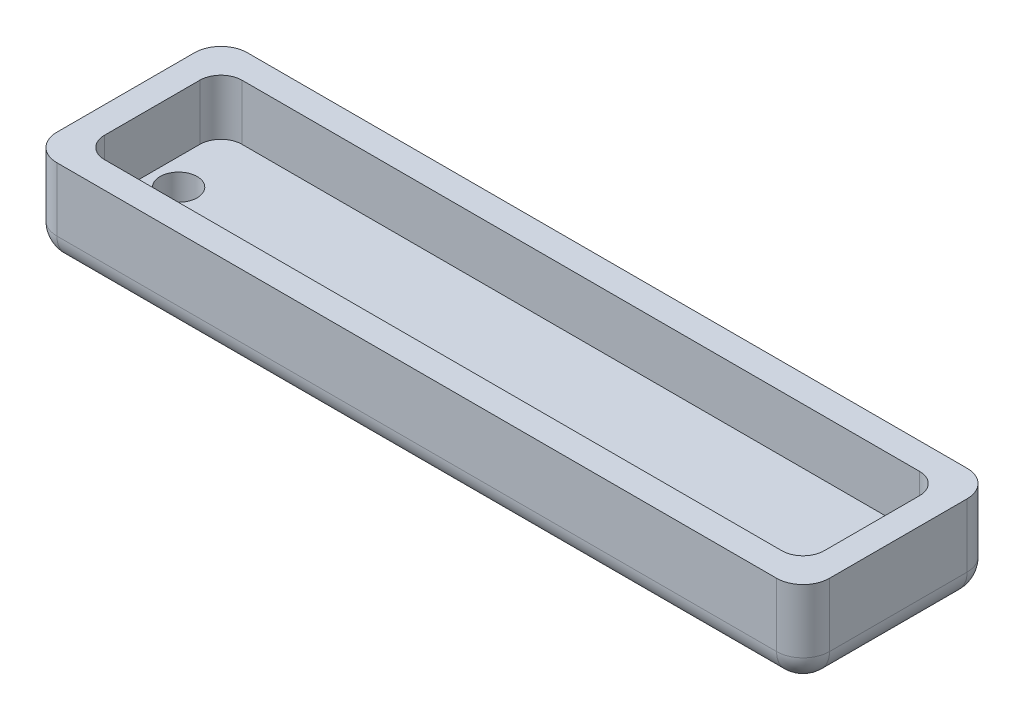
ISO-10303-21;
HEADER;
FILE_DESCRIPTION(('STEP AP214'),'2;1');
FILE_NAME('part.step','',(''),(''),'','','');
FILE_SCHEMA(('AUTOMOTIVE_DESIGN { 1 0 10303 214 1 1 1 1 }'));
ENDSEC;
DATA;
#1=APPLICATION_CONTEXT('core data for automotive mechanical design processes');
#2=APPLICATION_PROTOCOL_DEFINITION('international standard','automotive_design',2000,#1);
#3=PRODUCT_CONTEXT('',#1,'mechanical');
#4=PRODUCT('Part','Part','',(#3));
#5=PRODUCT_RELATED_PRODUCT_CATEGORY('part','',(#4));
#6=PRODUCT_DEFINITION_FORMATION('','',#4);
#7=PRODUCT_DEFINITION_CONTEXT('part definition',#1,'design');
#8=PRODUCT_DEFINITION('design','',#6,#7);
#9=PRODUCT_DEFINITION_SHAPE('','',#8);
#10=(LENGTH_UNIT() NAMED_UNIT(*) SI_UNIT(.MILLI.,.METRE.));
#11=(NAMED_UNIT(*) PLANE_ANGLE_UNIT() SI_UNIT($,.RADIAN.));
#12=(NAMED_UNIT(*) SI_UNIT($,.STERADIAN.) SOLID_ANGLE_UNIT());
#13=UNCERTAINTY_MEASURE_WITH_UNIT(LENGTH_MEASURE(1.E-05),#10,'distance_accuracy_value','');
#14=(GEOMETRIC_REPRESENTATION_CONTEXT(3) GLOBAL_UNCERTAINTY_ASSIGNED_CONTEXT((#13)) GLOBAL_UNIT_ASSIGNED_CONTEXT((#10,
#11,#12)) REPRESENTATION_CONTEXT('',''));
#15=CARTESIAN_POINT('',(0.,0.,0.));
#16=DIRECTION('',(0.,0.,1.));
#17=DIRECTION('',(1.,0.,0.));
#18=AXIS2_PLACEMENT_3D('',#15,#16,#17);
#19=CARTESIAN_POINT('',(18.542,4.318,4.572));
#20=DIRECTION('',(-1.,0.,0.));
#21=DIRECTION('',(0.,0.,1.));
#22=AXIS2_PLACEMENT_3D('',#19,#20,#21);
#23=PLANE('',#22);
#24=DIRECTION('',(0.,0.,-1.));
#25=VECTOR('',#24,1.);
#26=CARTESIAN_POINT('',(18.542,4.318,4.572));
#27=LINE('',#26,#25);
#28=CARTESIAN_POINT('',(18.542,4.318,3.302));
#29=VERTEX_POINT('',#28);
#30=CARTESIAN_POINT('',(18.542,4.318,-3.302));
#31=VERTEX_POINT('',#30);
#32=EDGE_CURVE('E323',#29,#31,#27,.T.);
#33=ORIENTED_EDGE('',*,*,#32,.F.);
#34=DIRECTION('',(0.,-1.,0.));
#35=VECTOR('',#34,1.);
#36=CARTESIAN_POINT('',(18.542,4.318,3.302));
#37=LINE('',#36,#35);
#38=CARTESIAN_POINT('',(18.542,1.27,3.302));
#39=VERTEX_POINT('',#38);
#40=EDGE_CURVE('E209',#29,#39,#37,.T.);
#41=ORIENTED_EDGE('',*,*,#40,.T.);
#42=DIRECTION('',(0.,0.,-1.));
#43=VECTOR('',#42,1.);
#44=CARTESIAN_POINT('',(18.542,1.27,-4.572));
#45=LINE('',#44,#43);
#46=CARTESIAN_POINT('',(18.542,1.27,-3.302));
#47=VERTEX_POINT('',#46);
#48=EDGE_CURVE('E207',#39,#47,#45,.T.);
#49=ORIENTED_EDGE('',*,*,#48,.T.);
#50=DIRECTION('',(0.,-1.,0.));
#51=VECTOR('',#50,1.);
#52=CARTESIAN_POINT('',(18.542,4.318,-3.302));
#53=LINE('',#52,#51);
#54=EDGE_CURVE('E205',#47,#31,#53,.F.);
#55=ORIENTED_EDGE('',*,*,#54,.T.);
#56=EDGE_LOOP('',(#33,#41,#49,#55));
#57=FACE_BOUND('',#56,.T.);
#58=ADVANCED_FACE('F34',(#57),#23,.F.);
#59=CARTESIAN_POINT('',(-18.542,4.318,-4.572));
#60=DIRECTION('',(0.,0.,1.));
#61=DIRECTION('',(1.,0.,0.));
#62=AXIS2_PLACEMENT_3D('',#59,#60,#61);
#63=PLANE('',#62);
#64=DIRECTION('',(-1.,0.,0.));
#65=VECTOR('',#64,1.);
#66=CARTESIAN_POINT('',(-18.542,1.27,-4.572));
#67=LINE('',#66,#65);
#68=CARTESIAN_POINT('',(17.272,1.27,-4.572));
#69=VERTEX_POINT('',#68);
#70=CARTESIAN_POINT('',(-17.272,1.27,-4.572));
#71=VERTEX_POINT('',#70);
#72=EDGE_CURVE('E184',#69,#71,#67,.T.);
#73=ORIENTED_EDGE('',*,*,#72,.T.);
#74=DIRECTION('',(0.,-1.,0.));
#75=VECTOR('',#74,1.);
#76=CARTESIAN_POINT('',(-17.272,4.318,-4.572));
#77=LINE('',#76,#75);
#78=CARTESIAN_POINT('',(-17.272,4.318,-4.572));
#79=VERTEX_POINT('',#78);
#80=EDGE_CURVE('E193',#71,#79,#77,.F.);
#81=ORIENTED_EDGE('',*,*,#80,.T.);
#82=DIRECTION('',(-1.,0.,0.));
#83=VECTOR('',#82,1.);
#84=CARTESIAN_POINT('',(-18.542,4.318,-4.572));
#85=LINE('',#84,#83);
#86=CARTESIAN_POINT('',(17.272,4.318,-4.572));
#87=VERTEX_POINT('',#86);
#88=EDGE_CURVE('E165',#87,#79,#85,.T.);
#89=ORIENTED_EDGE('',*,*,#88,.F.);
#90=DIRECTION('',(0.,-1.,0.));
#91=VECTOR('',#90,1.);
#92=CARTESIAN_POINT('',(17.272,4.318,-4.572));
#93=LINE('',#92,#91);
#94=EDGE_CURVE('E186',#87,#69,#93,.T.);
#95=ORIENTED_EDGE('',*,*,#94,.T.);
#96=EDGE_LOOP('',(#73,#81,#89,#95));
#97=FACE_BOUND('',#96,.T.);
#98=ADVANCED_FACE('F382',(#97),#63,.F.);
#99=CARTESIAN_POINT('',(-18.542,4.318,4.572));
#100=DIRECTION('',(1.,0.,0.));
#101=DIRECTION('',(0.,0.,-1.));
#102=AXIS2_PLACEMENT_3D('',#99,#100,#101);
#103=PLANE('',#102);
#104=DIRECTION('',(0.,0.,1.));
#105=VECTOR('',#104,1.);
#106=CARTESIAN_POINT('',(-18.542,4.318,4.572));
#107=LINE('',#106,#105);
#108=CARTESIAN_POINT('',(-18.542,4.318,-3.302));
#109=VERTEX_POINT('',#108);
#110=CARTESIAN_POINT('',(-18.542,4.318,3.302));
#111=VERTEX_POINT('',#110);
#112=EDGE_CURVE('E162',#109,#111,#107,.T.);
#113=ORIENTED_EDGE('',*,*,#112,.F.);
#114=DIRECTION('',(0.,-1.,0.));
#115=VECTOR('',#114,1.);
#116=CARTESIAN_POINT('',(-18.542,4.318,-3.302));
#117=LINE('',#116,#115);
#118=CARTESIAN_POINT('',(-18.542,1.27,-3.302));
#119=VERTEX_POINT('',#118);
#120=EDGE_CURVE('E175',#109,#119,#117,.T.);
#121=ORIENTED_EDGE('',*,*,#120,.T.);
#122=DIRECTION('',(0.,0.,1.));
#123=VECTOR('',#122,1.);
#124=CARTESIAN_POINT('',(-18.542,1.27,4.572));
#125=LINE('',#124,#123);
#126=CARTESIAN_POINT('',(-18.542,1.27,3.302));
#127=VERTEX_POINT('',#126);
#128=EDGE_CURVE('E188',#119,#127,#125,.T.);
#129=ORIENTED_EDGE('',*,*,#128,.T.);
#130=DIRECTION('',(0.,-1.,0.));
#131=VECTOR('',#130,1.);
#132=CARTESIAN_POINT('',(-18.542,4.318,3.302));
#133=LINE('',#132,#131);
#134=EDGE_CURVE('E177',#127,#111,#133,.F.);
#135=ORIENTED_EDGE('',*,*,#134,.T.);
#136=EDGE_LOOP('',(#113,#121,#129,#135));
#137=FACE_BOUND('',#136,.T.);
#138=ADVANCED_FACE('F174',(#137),#103,.F.);
#139=CARTESIAN_POINT('',(-18.542,4.318,4.572));
#140=DIRECTION('',(0.,0.,-1.));
#141=DIRECTION('',(-1.,0.,0.));
#142=AXIS2_PLACEMENT_3D('',#139,#140,#141);
#143=PLANE('',#142);
#144=DIRECTION('',(1.,0.,0.));
#145=VECTOR('',#144,1.);
#146=CARTESIAN_POINT('',(-18.542,4.318,4.572));
#147=LINE('',#146,#145);
#148=CARTESIAN_POINT('',(-17.272,4.318,4.572));
#149=VERTEX_POINT('',#148);
#150=CARTESIAN_POINT('',(17.272,4.318,4.572));
#151=VERTEX_POINT('',#150);
#152=EDGE_CURVE('E178',#149,#151,#147,.T.);
#153=ORIENTED_EDGE('',*,*,#152,.F.);
#154=DIRECTION('',(0.,-1.,0.));
#155=VECTOR('',#154,1.);
#156=CARTESIAN_POINT('',(-17.272,4.318,4.572));
#157=LINE('',#156,#155);
#158=CARTESIAN_POINT('',(-17.272,1.27,4.572));
#159=VERTEX_POINT('',#158);
#160=EDGE_CURVE('E203',#149,#159,#157,.T.);
#161=ORIENTED_EDGE('',*,*,#160,.T.);
#162=DIRECTION('',(1.,0.,0.));
#163=VECTOR('',#162,1.);
#164=CARTESIAN_POINT('',(18.542,1.27,4.572));
#165=LINE('',#164,#163);
#166=CARTESIAN_POINT('',(17.272,1.27,4.572));
#167=VERTEX_POINT('',#166);
#168=EDGE_CURVE('E169',#159,#167,#165,.T.);
#169=ORIENTED_EDGE('',*,*,#168,.T.);
#170=DIRECTION('',(0.,-1.,0.));
#171=VECTOR('',#170,1.);
#172=CARTESIAN_POINT('',(17.272,4.318,4.572));
#173=LINE('',#172,#171);
#174=EDGE_CURVE('E201',#167,#151,#173,.F.);
#175=ORIENTED_EDGE('',*,*,#174,.T.);
#176=EDGE_LOOP('',(#153,#161,#169,#175));
#177=FACE_BOUND('',#176,.T.);
#178=ADVANCED_FACE('F369',(#177),#143,.F.);
#179=CARTESIAN_POINT('',(0.,4.318,0.));
#180=DIRECTION('',(0.,-1.,0.));
#181=DIRECTION('',(0.,0.,-1.));
#182=AXIS2_PLACEMENT_3D('',#179,#180,#181);
#183=PLANE('',#182);
#184=DIRECTION('',(0.,0.,1.));
#185=VECTOR('',#184,1.);
#186=CARTESIAN_POINT('',(-17.272,4.318,-3.302));
#187=LINE('',#186,#185);
#188=CARTESIAN_POINT('',(-17.272,4.318,-2.286));
#189=VERTEX_POINT('',#188);
#190=CARTESIAN_POINT('',(-17.272,4.318,2.286));
#191=VERTEX_POINT('',#190);
#192=EDGE_CURVE('E318',#189,#191,#187,.T.);
#193=ORIENTED_EDGE('',*,*,#192,.F.);
#194=CARTESIAN_POINT('',(-16.256,4.318,-2.286));
#195=DIRECTION('',(0.,-1.,0.));
#196=DIRECTION('',(0.,0.,-1.));
#197=AXIS2_PLACEMENT_3D('',#194,#195,#196);
#198=CIRCLE('',#197,1.016);
#199=CARTESIAN_POINT('',(-16.256,4.318,-3.302));
#200=VERTEX_POINT('',#199);
#201=EDGE_CURVE('E12',#189,#200,#198,.T.);
#202=ORIENTED_EDGE('',*,*,#201,.T.);
#203=DIRECTION('',(-1.,0.,0.));
#204=VECTOR('',#203,1.);
#205=CARTESIAN_POINT('',(-17.272,4.318,-3.302));
#206=LINE('',#205,#204);
#207=CARTESIAN_POINT('',(16.256,4.318,-3.302));
#208=VERTEX_POINT('',#207);
#209=EDGE_CURVE('E289',#208,#200,#206,.T.);
#210=ORIENTED_EDGE('',*,*,#209,.F.);
#211=CARTESIAN_POINT('',(16.256,4.318,-2.286));
#212=DIRECTION('',(0.,-1.,0.));
#213=DIRECTION('',(0.,0.,-1.));
#214=AXIS2_PLACEMENT_3D('',#211,#212,#213);
#215=CIRCLE('',#214,1.016);
#216=CARTESIAN_POINT('',(17.272,4.318,-2.286));
#217=VERTEX_POINT('',#216);
#218=EDGE_CURVE('E284',#208,#217,#215,.T.);
#219=ORIENTED_EDGE('',*,*,#218,.T.);
#220=DIRECTION('',(0.,0.,-1.));
#221=VECTOR('',#220,1.);
#222=CARTESIAN_POINT('',(17.272,4.318,-3.302));
#223=LINE('',#222,#221);
#224=CARTESIAN_POINT('',(17.272,4.318,2.286));
#225=VERTEX_POINT('',#224);
#226=EDGE_CURVE('E255',#225,#217,#223,.T.);
#227=ORIENTED_EDGE('',*,*,#226,.F.);
#228=CARTESIAN_POINT('',(16.256,4.318,2.286));
#229=DIRECTION('',(0.,-1.,0.));
#230=DIRECTION('',(0.,0.,-1.));
#231=AXIS2_PLACEMENT_3D('',#228,#229,#230);
#232=CIRCLE('',#231,1.016);
#233=CARTESIAN_POINT('',(16.256,4.318,3.302));
#234=VERTEX_POINT('',#233);
#235=EDGE_CURVE('E282',#225,#234,#232,.T.);
#236=ORIENTED_EDGE('',*,*,#235,.T.);
#237=DIRECTION('',(1.,0.,0.));
#238=VECTOR('',#237,1.);
#239=CARTESIAN_POINT('',(-17.272,4.318,3.302));
#240=LINE('',#239,#238);
#241=CARTESIAN_POINT('',(-16.256,4.318,3.302));
#242=VERTEX_POINT('',#241);
#243=EDGE_CURVE('E312',#242,#234,#240,.T.);
#244=ORIENTED_EDGE('',*,*,#243,.F.);
#245=CARTESIAN_POINT('',(-16.256,4.318,2.286));
#246=DIRECTION('',(0.,-1.,0.));
#247=DIRECTION('',(0.,0.,-1.));
#248=AXIS2_PLACEMENT_3D('',#245,#246,#247);
#249=CIRCLE('',#248,1.016);
#250=EDGE_CURVE('E42',#242,#191,#249,.T.);
#251=ORIENTED_EDGE('',*,*,#250,.T.);
#252=EDGE_LOOP('',(#193,#202,#210,#219,#227,#236,#244,#251));
#253=FACE_BOUND('',#252,.T.);
#254=ORIENTED_EDGE('',*,*,#88,.T.);
#255=CARTESIAN_POINT('',(-17.272,4.318,-3.302));
#256=DIRECTION('',(0.,-1.,0.));
#257=DIRECTION('',(0.,0.,-1.));
#258=AXIS2_PLACEMENT_3D('',#255,#256,#257);
#259=CIRCLE('',#258,1.27);
#260=EDGE_CURVE('E159',#79,#109,#259,.F.);
#261=ORIENTED_EDGE('',*,*,#260,.T.);
#262=ORIENTED_EDGE('',*,*,#112,.T.);
#263=CARTESIAN_POINT('',(-17.272,4.318,3.302));
#264=DIRECTION('',(0.,-1.,0.));
#265=DIRECTION('',(0.,0.,-1.));
#266=AXIS2_PLACEMENT_3D('',#263,#264,#265);
#267=CIRCLE('',#266,1.27);
#268=EDGE_CURVE('E170',#111,#149,#267,.F.);
#269=ORIENTED_EDGE('',*,*,#268,.T.);
#270=ORIENTED_EDGE('',*,*,#152,.T.);
#271=CARTESIAN_POINT('',(17.272,4.318,3.302));
#272=DIRECTION('',(0.,-1.,0.));
#273=DIRECTION('',(0.,0.,-1.));
#274=AXIS2_PLACEMENT_3D('',#271,#272,#273);
#275=CIRCLE('',#274,1.27);
#276=EDGE_CURVE('E197',#151,#29,#275,.F.);
#277=ORIENTED_EDGE('',*,*,#276,.T.);
#278=ORIENTED_EDGE('',*,*,#32,.T.);
#279=CARTESIAN_POINT('',(17.272,4.318,-3.302));
#280=DIRECTION('',(0.,-1.,0.));
#281=DIRECTION('',(0.,0.,-1.));
#282=AXIS2_PLACEMENT_3D('',#279,#280,#281);
#283=CIRCLE('',#282,1.27);
#284=EDGE_CURVE('E195',#31,#87,#283,.F.);
#285=ORIENTED_EDGE('',*,*,#284,.T.);
#286=EDGE_LOOP('',(#254,#261,#262,#269,#270,#277,#278,#285));
#287=FACE_BOUND('',#286,.T.);
#288=ADVANCED_FACE('F161',(#253,#287),#183,.F.);
#289=CARTESIAN_POINT('',(0.,0.,0.));
#290=DIRECTION('',(0.,-1.,0.));
#291=DIRECTION('',(0.,0.,-1.));
#292=AXIS2_PLACEMENT_3D('',#289,#290,#291);
#293=PLANE('',#292);
#294=CARTESIAN_POINT('',(-16.002,0.,0.));
#295=DIRECTION('',(0.,1.,0.));
#296=DIRECTION('',(0.,0.,1.));
#297=AXIS2_PLACEMENT_3D('',#294,#295,#296);
#298=CIRCLE('',#297,0.889000000000002);
#299=CARTESIAN_POINT('',(-16.002,0.,0.889000000000006));
#300=VERTEX_POINT('',#299);
#301=EDGE_CURVE('E223',#300,#300,#298,.T.);
#302=ORIENTED_EDGE('',*,*,#301,.T.);
#303=EDGE_LOOP('',(#302));
#304=FACE_BOUND('',#303,.T.);
#305=CARTESIAN_POINT('',(16.002,0.,0.));
#306=DIRECTION('',(0.,1.,0.));
#307=DIRECTION('',(0.,0.,1.));
#308=AXIS2_PLACEMENT_3D('',#305,#306,#307);
#309=CIRCLE('',#308,0.889);
#310=CARTESIAN_POINT('',(16.002,0.,0.889));
#311=VERTEX_POINT('',#310);
#312=EDGE_CURVE('E440',#311,#311,#309,.T.);
#313=ORIENTED_EDGE('',*,*,#312,.T.);
#314=EDGE_LOOP('',(#313));
#315=FACE_BOUND('',#314,.T.);
#316=DIRECTION('',(0.,0.,-1.));
#317=VECTOR('',#316,1.);
#318=CARTESIAN_POINT('',(17.272,0.,4.572));
#319=LINE('',#318,#317);
#320=CARTESIAN_POINT('',(17.272,0.,-3.302));
#321=VERTEX_POINT('',#320);
#322=CARTESIAN_POINT('',(17.272,0.,3.302));
#323=VERTEX_POINT('',#322);
#324=EDGE_CURVE('E213',#321,#323,#319,.F.);
#325=ORIENTED_EDGE('',*,*,#324,.T.);
#326=DIRECTION('',(1.,0.,0.));
#327=VECTOR('',#326,1.);
#328=CARTESIAN_POINT('',(-18.542,0.,3.302));
#329=LINE('',#328,#327);
#330=CARTESIAN_POINT('',(-17.272,0.,3.302));
#331=VERTEX_POINT('',#330);
#332=EDGE_CURVE('E217',#323,#331,#329,.F.);
#333=ORIENTED_EDGE('',*,*,#332,.T.);
#334=DIRECTION('',(0.,0.,1.));
#335=VECTOR('',#334,1.);
#336=CARTESIAN_POINT('',(-17.272,0.,-4.572));
#337=LINE('',#336,#335);
#338=CARTESIAN_POINT('',(-17.272,0.,-3.302));
#339=VERTEX_POINT('',#338);
#340=EDGE_CURVE('E215',#331,#339,#337,.F.);
#341=ORIENTED_EDGE('',*,*,#340,.T.);
#342=DIRECTION('',(-1.,0.,0.));
#343=VECTOR('',#342,1.);
#344=CARTESIAN_POINT('',(18.542,0.,-3.302));
#345=LINE('',#344,#343);
#346=EDGE_CURVE('E211',#339,#321,#345,.F.);
#347=ORIENTED_EDGE('',*,*,#346,.T.);
#348=EDGE_LOOP('',(#325,#333,#341,#347));
#349=FACE_BOUND('',#348,.T.);
#350=ADVANCED_FACE('F343',(#304,#315,#349),#293,.T.);
#351=CARTESIAN_POINT('',(0.,1.651,0.));
#352=DIRECTION('',(0.,-1.,0.));
#353=DIRECTION('',(0.,0.,-1.));
#354=AXIS2_PLACEMENT_3D('',#351,#352,#353);
#355=PLANE('',#354);
#356=CARTESIAN_POINT('',(-16.002,1.651,0.));
#357=DIRECTION('',(0.,1.,0.));
#358=DIRECTION('',(0.,0.,1.));
#359=AXIS2_PLACEMENT_3D('',#356,#357,#358);
#360=CIRCLE('',#359,0.889000000000002);
#361=CARTESIAN_POINT('',(-16.002,1.651,0.889000000000006));
#362=VERTEX_POINT('',#361);
#363=EDGE_CURVE('E439',#362,#362,#360,.T.);
#364=ORIENTED_EDGE('',*,*,#363,.F.);
#365=EDGE_LOOP('',(#364));
#366=FACE_BOUND('',#365,.T.);
#367=CARTESIAN_POINT('',(16.002,1.651,0.));
#368=DIRECTION('',(0.,1.,0.));
#369=DIRECTION('',(0.,0.,1.));
#370=AXIS2_PLACEMENT_3D('',#367,#368,#369);
#371=CIRCLE('',#370,0.889);
#372=CARTESIAN_POINT('',(16.002,1.651,0.889));
#373=VERTEX_POINT('',#372);
#374=EDGE_CURVE('E444',#373,#373,#371,.T.);
#375=ORIENTED_EDGE('',*,*,#374,.F.);
#376=EDGE_LOOP('',(#375));
#377=FACE_BOUND('',#376,.T.);
#378=DIRECTION('',(1.,0.,0.));
#379=VECTOR('',#378,1.);
#380=CARTESIAN_POINT('',(-17.272,1.651,3.302));
#381=LINE('',#380,#379);
#382=CARTESIAN_POINT('',(-16.256,1.651,3.302));
#383=VERTEX_POINT('',#382);
#384=CARTESIAN_POINT('',(16.256,1.651,3.302));
#385=VERTEX_POINT('',#384);
#386=EDGE_CURVE('E315',#383,#385,#381,.T.);
#387=ORIENTED_EDGE('',*,*,#386,.T.);
#388=CARTESIAN_POINT('',(16.256,1.651,2.286));
#389=DIRECTION('',(0.,-1.,0.));
#390=DIRECTION('',(0.,0.,-1.));
#391=AXIS2_PLACEMENT_3D('',#388,#389,#390);
#392=CIRCLE('',#391,1.016);
#393=CARTESIAN_POINT('',(17.272,1.651,2.286));
#394=VERTEX_POINT('',#393);
#395=EDGE_CURVE('E271',#385,#394,#392,.F.);
#396=ORIENTED_EDGE('',*,*,#395,.T.);
#397=DIRECTION('',(0.,0.,-1.));
#398=VECTOR('',#397,1.);
#399=CARTESIAN_POINT('',(17.272,1.651,-3.302));
#400=LINE('',#399,#398);
#401=CARTESIAN_POINT('',(17.272,1.651,-2.286));
#402=VERTEX_POINT('',#401);
#403=EDGE_CURVE('E308',#394,#402,#400,.T.);
#404=ORIENTED_EDGE('',*,*,#403,.T.);
#405=CARTESIAN_POINT('',(16.256,1.651,-2.286));
#406=DIRECTION('',(0.,-1.,0.));
#407=DIRECTION('',(0.,0.,-1.));
#408=AXIS2_PLACEMENT_3D('',#405,#406,#407);
#409=CIRCLE('',#408,1.016);
#410=CARTESIAN_POINT('',(16.256,1.651,-3.302));
#411=VERTEX_POINT('',#410);
#412=EDGE_CURVE('E269',#402,#411,#409,.F.);
#413=ORIENTED_EDGE('',*,*,#412,.T.);
#414=DIRECTION('',(-1.,0.,0.));
#415=VECTOR('',#414,1.);
#416=CARTESIAN_POINT('',(-17.272,1.651,-3.302));
#417=LINE('',#416,#415);
#418=CARTESIAN_POINT('',(-16.256,1.651,-3.302));
#419=VERTEX_POINT('',#418);
#420=EDGE_CURVE('E306',#411,#419,#417,.T.);
#421=ORIENTED_EDGE('',*,*,#420,.T.);
#422=CARTESIAN_POINT('',(-16.256,1.651,-2.286));
#423=DIRECTION('',(0.,-1.,0.));
#424=DIRECTION('',(0.,0.,-1.));
#425=AXIS2_PLACEMENT_3D('',#422,#423,#424);
#426=CIRCLE('',#425,1.016);
#427=CARTESIAN_POINT('',(-17.272,1.651,-2.286));
#428=VERTEX_POINT('',#427);
#429=EDGE_CURVE('E265',#419,#428,#426,.F.);
#430=ORIENTED_EDGE('',*,*,#429,.T.);
#431=DIRECTION('',(0.,0.,1.));
#432=VECTOR('',#431,1.);
#433=CARTESIAN_POINT('',(-17.272,1.651,-3.302));
#434=LINE('',#433,#432);
#435=CARTESIAN_POINT('',(-17.272,1.651,2.286));
#436=VERTEX_POINT('',#435);
#437=EDGE_CURVE('E311',#428,#436,#434,.T.);
#438=ORIENTED_EDGE('',*,*,#437,.T.);
#439=CARTESIAN_POINT('',(-16.256,1.651,2.286));
#440=DIRECTION('',(0.,-1.,0.));
#441=DIRECTION('',(0.,0.,-1.));
#442=AXIS2_PLACEMENT_3D('',#439,#440,#441);
#443=CIRCLE('',#442,1.016);
#444=EDGE_CURVE('E267',#436,#383,#443,.F.);
#445=ORIENTED_EDGE('',*,*,#444,.T.);
#446=EDGE_LOOP('',(#387,#396,#404,#413,#421,#430,#438,#445));
#447=FACE_BOUND('',#446,.T.);
#448=ADVANCED_FACE('F305',(#366,#377,#447),#355,.F.);
#449=CARTESIAN_POINT('',(-17.272,-35.1695998271234,-3.302));
#450=DIRECTION('',(0.,0.,-1.));
#451=DIRECTION('',(-1.,0.,0.));
#452=AXIS2_PLACEMENT_3D('',#449,#450,#451);
#453=PLANE('',#452);
#454=ORIENTED_EDGE('',*,*,#420,.F.);
#455=DIRECTION('',(0.,1.,0.));
#456=VECTOR('',#455,1.);
#457=CARTESIAN_POINT('',(16.256,4.318,-3.302));
#458=LINE('',#457,#456);
#459=EDGE_CURVE('E275',#411,#208,#458,.T.);
#460=ORIENTED_EDGE('',*,*,#459,.T.);
#461=ORIENTED_EDGE('',*,*,#209,.T.);
#462=DIRECTION('',(0.,1.,0.));
#463=VECTOR('',#462,1.);
#464=CARTESIAN_POINT('',(-16.256,1.651,-3.302));
#465=LINE('',#464,#463);
#466=EDGE_CURVE('E273',#200,#419,#465,.F.);
#467=ORIENTED_EDGE('',*,*,#466,.T.);
#468=EDGE_LOOP('',(#454,#460,#461,#467));
#469=FACE_BOUND('',#468,.T.);
#470=ADVANCED_FACE('F310',(#469),#453,.F.);
#471=CARTESIAN_POINT('',(-17.272,-35.1695998271234,-3.302));
#472=DIRECTION('',(-1.,0.,0.));
#473=DIRECTION('',(0.,0.,1.));
#474=AXIS2_PLACEMENT_3D('',#471,#472,#473);
#475=PLANE('',#474);
#476=ORIENTED_EDGE('',*,*,#192,.T.);
#477=DIRECTION('',(0.,1.,0.));
#478=VECTOR('',#477,1.);
#479=CARTESIAN_POINT('',(-17.272,1.651,2.286));
#480=LINE('',#479,#478);
#481=EDGE_CURVE('E280',#191,#436,#480,.F.);
#482=ORIENTED_EDGE('',*,*,#481,.T.);
#483=ORIENTED_EDGE('',*,*,#437,.F.);
#484=DIRECTION('',(0.,1.,0.));
#485=VECTOR('',#484,1.);
#486=CARTESIAN_POINT('',(-17.272,4.318,-2.286));
#487=LINE('',#486,#485);
#488=EDGE_CURVE('E278',#428,#189,#487,.T.);
#489=ORIENTED_EDGE('',*,*,#488,.T.);
#490=EDGE_LOOP('',(#476,#482,#483,#489));
#491=FACE_BOUND('',#490,.T.);
#492=ADVANCED_FACE('F415',(#491),#475,.F.);
#493=CARTESIAN_POINT('',(-17.272,-35.1695998271234,3.302));
#494=DIRECTION('',(0.,0.,1.));
#495=DIRECTION('',(1.,0.,0.));
#496=AXIS2_PLACEMENT_3D('',#493,#494,#495);
#497=PLANE('',#496);
#498=ORIENTED_EDGE('',*,*,#243,.T.);
#499=DIRECTION('',(0.,1.,0.));
#500=VECTOR('',#499,1.);
#501=CARTESIAN_POINT('',(16.256,1.651,3.302));
#502=LINE('',#501,#500);
#503=EDGE_CURVE('E263',#234,#385,#502,.F.);
#504=ORIENTED_EDGE('',*,*,#503,.T.);
#505=ORIENTED_EDGE('',*,*,#386,.F.);
#506=DIRECTION('',(0.,1.,0.));
#507=VECTOR('',#506,1.);
#508=CARTESIAN_POINT('',(-16.256,4.318,3.302));
#509=LINE('',#508,#507);
#510=EDGE_CURVE('E260',#383,#242,#509,.T.);
#511=ORIENTED_EDGE('',*,*,#510,.T.);
#512=EDGE_LOOP('',(#498,#504,#505,#511));
#513=FACE_BOUND('',#512,.T.);
#514=ADVANCED_FACE('F418',(#513),#497,.F.);
#515=CARTESIAN_POINT('',(17.272,-35.1695998271234,-3.302));
#516=DIRECTION('',(1.,0.,0.));
#517=DIRECTION('',(0.,0.,-1.));
#518=AXIS2_PLACEMENT_3D('',#515,#516,#517);
#519=PLANE('',#518);
#520=ORIENTED_EDGE('',*,*,#403,.F.);
#521=DIRECTION('',(0.,1.,0.));
#522=VECTOR('',#521,1.);
#523=CARTESIAN_POINT('',(17.272,4.318,2.286));
#524=LINE('',#523,#522);
#525=EDGE_CURVE('E257',#394,#225,#524,.T.);
#526=ORIENTED_EDGE('',*,*,#525,.T.);
#527=ORIENTED_EDGE('',*,*,#226,.T.);
#528=DIRECTION('',(0.,1.,0.));
#529=VECTOR('',#528,1.);
#530=CARTESIAN_POINT('',(17.272,1.651,-2.286));
#531=LINE('',#530,#529);
#532=EDGE_CURVE('E220',#217,#402,#531,.F.);
#533=ORIENTED_EDGE('',*,*,#532,.T.);
#534=EDGE_LOOP('',(#520,#526,#527,#533));
#535=FACE_BOUND('',#534,.T.);
#536=ADVANCED_FACE('F295',(#535),#519,.F.);
#537=CARTESIAN_POINT('',(17.272,4.318,3.302));
#538=DIRECTION('',(0.,-1.,0.));
#539=DIRECTION('',(0.,0.,-1.));
#540=AXIS2_PLACEMENT_3D('',#537,#538,#539);
#541=CYLINDRICAL_SURFACE('',#540,1.27);
#542=CARTESIAN_POINT('',(17.272,1.27,3.302));
#543=DIRECTION('',(0.,-1.,0.));
#544=DIRECTION('',(0.,0.,-1.));
#545=AXIS2_PLACEMENT_3D('',#542,#543,#544);
#546=CIRCLE('',#545,1.27);
#547=EDGE_CURVE('E252',#39,#167,#546,.T.);
#548=ORIENTED_EDGE('',*,*,#547,.F.);
#549=ORIENTED_EDGE('',*,*,#40,.F.);
#550=ORIENTED_EDGE('',*,*,#276,.F.);
#551=ORIENTED_EDGE('',*,*,#174,.F.);
#552=EDGE_LOOP('',(#548,#549,#550,#551));
#553=FACE_BOUND('',#552,.T.);
#554=ADVANCED_FACE('F372',(#553),#541,.T.);
#555=CARTESIAN_POINT('',(17.272,1.27,3.302));
#556=DIRECTION('',(0.,0.,1.));
#557=DIRECTION('',(1.,0.,0.));
#558=AXIS2_PLACEMENT_3D('',#555,#556,#557);
#559=SPHERICAL_SURFACE('',#558,1.27);
#560=CARTESIAN_POINT('',(17.272,1.27,3.302));
#561=DIRECTION('',(0.,0.,1.));
#562=DIRECTION('',(1.,0.,0.));
#563=AXIS2_PLACEMENT_3D('',#560,#561,#562);
#564=CIRCLE('',#563,1.27);
#565=EDGE_CURVE('E246',#39,#323,#564,.F.);
#566=ORIENTED_EDGE('',*,*,#565,.F.);
#567=ORIENTED_EDGE('',*,*,#547,.T.);
#568=CARTESIAN_POINT('',(17.272,1.27,3.302));
#569=DIRECTION('',(1.,0.,0.));
#570=DIRECTION('',(0.,0.,-1.));
#571=AXIS2_PLACEMENT_3D('',#568,#569,#570);
#572=CIRCLE('',#571,1.27);
#573=EDGE_CURVE('E249',#323,#167,#572,.F.);
#574=ORIENTED_EDGE('',*,*,#573,.F.);
#575=EDGE_LOOP('',(#566,#567,#574));
#576=FACE_BOUND('',#575,.T.);
#577=ADVANCED_FACE('F361',(#576),#559,.T.);
#578=CARTESIAN_POINT('',(-17.272,4.318,3.302));
#579=DIRECTION('',(0.,-1.,0.));
#580=DIRECTION('',(0.,0.,-1.));
#581=AXIS2_PLACEMENT_3D('',#578,#579,#580);
#582=CYLINDRICAL_SURFACE('',#581,1.27);
#583=ORIENTED_EDGE('',*,*,#268,.F.);
#584=ORIENTED_EDGE('',*,*,#134,.F.);
#585=CARTESIAN_POINT('',(-17.272,1.27,3.302));
#586=DIRECTION('',(0.,-1.,0.));
#587=DIRECTION('',(0.,0.,-1.));
#588=AXIS2_PLACEMENT_3D('',#585,#586,#587);
#589=CIRCLE('',#588,1.27);
#590=EDGE_CURVE('E243',#159,#127,#589,.T.);
#591=ORIENTED_EDGE('',*,*,#590,.F.);
#592=ORIENTED_EDGE('',*,*,#160,.F.);
#593=EDGE_LOOP('',(#583,#584,#591,#592));
#594=FACE_BOUND('',#593,.T.);
#595=ADVANCED_FACE('F334',(#594),#582,.T.);
#596=CARTESIAN_POINT('',(-18.542,1.27,3.302));
#597=DIRECTION('',(-1.,0.,0.));
#598=DIRECTION('',(0.,0.,1.));
#599=AXIS2_PLACEMENT_3D('',#596,#597,#598);
#600=CYLINDRICAL_SURFACE('',#599,1.27);
#601=ORIENTED_EDGE('',*,*,#573,.T.);
#602=ORIENTED_EDGE('',*,*,#168,.F.);
#603=CARTESIAN_POINT('',(-17.272,1.27,3.302));
#604=DIRECTION('',(-1.,0.,0.));
#605=DIRECTION('',(0.,0.,1.));
#606=AXIS2_PLACEMENT_3D('',#603,#604,#605);
#607=CIRCLE('',#606,1.27);
#608=EDGE_CURVE('E240',#331,#159,#607,.T.);
#609=ORIENTED_EDGE('',*,*,#608,.F.);
#610=ORIENTED_EDGE('',*,*,#332,.F.);
#611=EDGE_LOOP('',(#601,#602,#609,#610));
#612=FACE_BOUND('',#611,.T.);
#613=ADVANCED_FACE('F365',(#612),#600,.T.);
#614=CARTESIAN_POINT('',(17.272,1.27,4.572));
#615=DIRECTION('',(0.,0.,1.));
#616=DIRECTION('',(1.,0.,0.));
#617=AXIS2_PLACEMENT_3D('',#614,#615,#616);
#618=CYLINDRICAL_SURFACE('',#617,1.27);
#619=ORIENTED_EDGE('',*,*,#565,.T.);
#620=ORIENTED_EDGE('',*,*,#324,.F.);
#621=CARTESIAN_POINT('',(17.272,1.27,-3.302));
#622=DIRECTION('',(0.,0.,-1.));
#623=DIRECTION('',(-1.,0.,0.));
#624=AXIS2_PLACEMENT_3D('',#621,#622,#623);
#625=CIRCLE('',#624,1.27);
#626=EDGE_CURVE('E237',#47,#321,#625,.T.);
#627=ORIENTED_EDGE('',*,*,#626,.F.);
#628=ORIENTED_EDGE('',*,*,#48,.F.);
#629=EDGE_LOOP('',(#619,#620,#627,#628));
#630=FACE_BOUND('',#629,.T.);
#631=ADVANCED_FACE('F357',(#630),#618,.T.);
#632=CARTESIAN_POINT('',(17.272,4.318,-3.302));
#633=DIRECTION('',(0.,-1.,0.));
#634=DIRECTION('',(0.,0.,-1.));
#635=AXIS2_PLACEMENT_3D('',#632,#633,#634);
#636=CYLINDRICAL_SURFACE('',#635,1.27);
#637=ORIENTED_EDGE('',*,*,#284,.F.);
#638=ORIENTED_EDGE('',*,*,#54,.F.);
#639=CARTESIAN_POINT('',(17.272,1.27,-3.302));
#640=DIRECTION('',(0.,-1.,0.));
#641=DIRECTION('',(0.,0.,-1.));
#642=AXIS2_PLACEMENT_3D('',#639,#640,#641);
#643=CIRCLE('',#642,1.27);
#644=EDGE_CURVE('E234',#69,#47,#643,.T.);
#645=ORIENTED_EDGE('',*,*,#644,.F.);
#646=ORIENTED_EDGE('',*,*,#94,.F.);
#647=EDGE_LOOP('',(#637,#638,#645,#646));
#648=FACE_BOUND('',#647,.T.);
#649=ADVANCED_FACE('F379',(#648),#636,.T.);
#650=CARTESIAN_POINT('',(-17.272,1.27,3.302));
#651=DIRECTION('',(0.,0.,1.));
#652=DIRECTION('',(1.,0.,0.));
#653=AXIS2_PLACEMENT_3D('',#650,#651,#652);
#654=SPHERICAL_SURFACE('',#653,1.27);
#655=ORIENTED_EDGE('',*,*,#608,.T.);
#656=ORIENTED_EDGE('',*,*,#590,.T.);
#657=CARTESIAN_POINT('',(-17.272,1.27,3.302));
#658=DIRECTION('',(0.,0.,1.));
#659=DIRECTION('',(1.,0.,0.));
#660=AXIS2_PLACEMENT_3D('',#657,#658,#659);
#661=CIRCLE('',#660,1.27);
#662=EDGE_CURVE('E231',#331,#127,#661,.F.);
#663=ORIENTED_EDGE('',*,*,#662,.F.);
#664=EDGE_LOOP('',(#655,#656,#663));
#665=FACE_BOUND('',#664,.T.);
#666=ADVANCED_FACE('F338',(#665),#654,.T.);
#667=CARTESIAN_POINT('',(17.272,1.27,-3.302));
#668=DIRECTION('',(0.,0.,1.));
#669=DIRECTION('',(1.,0.,0.));
#670=AXIS2_PLACEMENT_3D('',#667,#668,#669);
#671=SPHERICAL_SURFACE('',#670,1.27);
#672=ORIENTED_EDGE('',*,*,#644,.T.);
#673=ORIENTED_EDGE('',*,*,#626,.T.);
#674=CARTESIAN_POINT('',(17.272,1.27,-3.302));
#675=DIRECTION('',(1.,0.,0.));
#676=DIRECTION('',(0.,0.,-1.));
#677=AXIS2_PLACEMENT_3D('',#674,#675,#676);
#678=CIRCLE('',#677,1.27);
#679=EDGE_CURVE('E228',#69,#321,#678,.F.);
#680=ORIENTED_EDGE('',*,*,#679,.F.);
#681=EDGE_LOOP('',(#672,#673,#680));
#682=FACE_BOUND('',#681,.T.);
#683=ADVANCED_FACE('F352',(#682),#671,.T.);
#684=CARTESIAN_POINT('',(-17.272,1.27,4.572));
#685=DIRECTION('',(0.,0.,-1.));
#686=DIRECTION('',(-1.,0.,0.));
#687=AXIS2_PLACEMENT_3D('',#684,#685,#686);
#688=CYLINDRICAL_SURFACE('',#687,1.27);
#689=ORIENTED_EDGE('',*,*,#662,.T.);
#690=ORIENTED_EDGE('',*,*,#128,.F.);
#691=CARTESIAN_POINT('',(-17.272,1.27,-3.302));
#692=DIRECTION('',(0.,0.,-1.));
#693=DIRECTION('',(-1.,0.,0.));
#694=AXIS2_PLACEMENT_3D('',#691,#692,#693);
#695=CIRCLE('',#694,1.27);
#696=EDGE_CURVE('E226',#339,#119,#695,.T.);
#697=ORIENTED_EDGE('',*,*,#696,.F.);
#698=ORIENTED_EDGE('',*,*,#340,.F.);
#699=EDGE_LOOP('',(#689,#690,#697,#698));
#700=FACE_BOUND('',#699,.T.);
#701=ADVANCED_FACE('F340',(#700),#688,.T.);
#702=CARTESIAN_POINT('',(-18.542,1.27,-3.302));
#703=DIRECTION('',(1.,0.,0.));
#704=DIRECTION('',(0.,0.,-1.));
#705=AXIS2_PLACEMENT_3D('',#702,#703,#704);
#706=CYLINDRICAL_SURFACE('',#705,1.27);
#707=ORIENTED_EDGE('',*,*,#679,.T.);
#708=ORIENTED_EDGE('',*,*,#346,.F.);
#709=CARTESIAN_POINT('',(-17.272,1.27,-3.302));
#710=DIRECTION('',(-1.,0.,0.));
#711=DIRECTION('',(0.,0.,1.));
#712=AXIS2_PLACEMENT_3D('',#709,#710,#711);
#713=CIRCLE('',#712,1.27);
#714=EDGE_CURVE('E222',#71,#339,#713,.T.);
#715=ORIENTED_EDGE('',*,*,#714,.F.);
#716=ORIENTED_EDGE('',*,*,#72,.F.);
#717=EDGE_LOOP('',(#707,#708,#715,#716));
#718=FACE_BOUND('',#717,.T.);
#719=ADVANCED_FACE('F348',(#718),#706,.T.);
#720=CARTESIAN_POINT('',(-17.272,1.27,-3.302));
#721=DIRECTION('',(0.,0.,1.));
#722=DIRECTION('',(1.,0.,0.));
#723=AXIS2_PLACEMENT_3D('',#720,#721,#722);
#724=SPHERICAL_SURFACE('',#723,1.27);
#725=ORIENTED_EDGE('',*,*,#714,.T.);
#726=ORIENTED_EDGE('',*,*,#696,.T.);
#727=CARTESIAN_POINT('',(-17.272,1.27,-3.302));
#728=DIRECTION('',(0.,-1.,0.));
#729=DIRECTION('',(0.,0.,-1.));
#730=AXIS2_PLACEMENT_3D('',#727,#728,#729);
#731=CIRCLE('',#730,1.27);
#732=EDGE_CURVE('E182',#71,#119,#731,.F.);
#733=ORIENTED_EDGE('',*,*,#732,.F.);
#734=EDGE_LOOP('',(#725,#726,#733));
#735=FACE_BOUND('',#734,.T.);
#736=ADVANCED_FACE('F384',(#735),#724,.T.);
#737=CARTESIAN_POINT('',(-17.272,4.318,-3.302));
#738=DIRECTION('',(0.,-1.,0.));
#739=DIRECTION('',(0.,0.,-1.));
#740=AXIS2_PLACEMENT_3D('',#737,#738,#739);
#741=CYLINDRICAL_SURFACE('',#740,1.27);
#742=ORIENTED_EDGE('',*,*,#260,.F.);
#743=ORIENTED_EDGE('',*,*,#80,.F.);
#744=ORIENTED_EDGE('',*,*,#732,.T.);
#745=ORIENTED_EDGE('',*,*,#120,.F.);
#746=EDGE_LOOP('',(#742,#743,#744,#745));
#747=FACE_BOUND('',#746,.T.);
#748=ADVANCED_FACE('F180',(#747),#741,.T.);
#749=CARTESIAN_POINT('',(16.256,-35.1695998271234,2.286));
#750=DIRECTION('',(0.,-1.,0.));
#751=DIRECTION('',(0.,0.,-1.));
#752=AXIS2_PLACEMENT_3D('',#749,#750,#751);
#753=CYLINDRICAL_SURFACE('',#752,1.016);
#754=ORIENTED_EDGE('',*,*,#395,.F.);
#755=ORIENTED_EDGE('',*,*,#503,.F.);
#756=ORIENTED_EDGE('',*,*,#235,.F.);
#757=ORIENTED_EDGE('',*,*,#525,.F.);
#758=EDGE_LOOP('',(#754,#755,#756,#757));
#759=FACE_BOUND('',#758,.T.);
#760=ADVANCED_FACE('F391',(#759),#753,.F.);
#761=CARTESIAN_POINT('',(16.256,-35.1695998271234,-2.286));
#762=DIRECTION('',(0.,-1.,0.));
#763=DIRECTION('',(0.,0.,-1.));
#764=AXIS2_PLACEMENT_3D('',#761,#762,#763);
#765=CYLINDRICAL_SURFACE('',#764,1.016);
#766=ORIENTED_EDGE('',*,*,#412,.F.);
#767=ORIENTED_EDGE('',*,*,#532,.F.);
#768=ORIENTED_EDGE('',*,*,#218,.F.);
#769=ORIENTED_EDGE('',*,*,#459,.F.);
#770=EDGE_LOOP('',(#766,#767,#768,#769));
#771=FACE_BOUND('',#770,.T.);
#772=ADVANCED_FACE('F300',(#771),#765,.F.);
#773=CARTESIAN_POINT('',(-16.256,-35.1695998271234,2.286));
#774=DIRECTION('',(0.,-1.,0.));
#775=DIRECTION('',(0.,0.,-1.));
#776=AXIS2_PLACEMENT_3D('',#773,#774,#775);
#777=CYLINDRICAL_SURFACE('',#776,1.016);
#778=ORIENTED_EDGE('',*,*,#444,.F.);
#779=ORIENTED_EDGE('',*,*,#481,.F.);
#780=ORIENTED_EDGE('',*,*,#250,.F.);
#781=ORIENTED_EDGE('',*,*,#510,.F.);
#782=EDGE_LOOP('',(#778,#779,#780,#781));
#783=FACE_BOUND('',#782,.T.);
#784=ADVANCED_FACE('F453',(#783),#777,.F.);
#785=CARTESIAN_POINT('',(-16.256,-35.1695998271234,-2.286));
#786=DIRECTION('',(0.,-1.,0.));
#787=DIRECTION('',(0.,0.,-1.));
#788=AXIS2_PLACEMENT_3D('',#785,#786,#787);
#789=CYLINDRICAL_SURFACE('',#788,1.016);
#790=ORIENTED_EDGE('',*,*,#429,.F.);
#791=ORIENTED_EDGE('',*,*,#466,.F.);
#792=ORIENTED_EDGE('',*,*,#201,.F.);
#793=ORIENTED_EDGE('',*,*,#488,.F.);
#794=EDGE_LOOP('',(#790,#791,#792,#793));
#795=FACE_BOUND('',#794,.T.);
#796=ADVANCED_FACE('F36',(#795),#789,.F.);
#797=CARTESIAN_POINT('',(16.002,0.,0.));
#798=DIRECTION('',(0.,1.,0.));
#799=DIRECTION('',(0.,0.,1.));
#800=AXIS2_PLACEMENT_3D('',#797,#798,#799);
#801=CYLINDRICAL_SURFACE('',#800,0.889);
#802=CARTESIAN_POINT('',(16.002,0.,0.889));
#803=CARTESIAN_POINT('',(16.002,0.0171979166666667,0.889));
#804=CARTESIAN_POINT('',(16.002,0.0343958333333333,0.889));
#805=CARTESIAN_POINT('',(16.002,0.0687916666666667,0.889));
#806=CARTESIAN_POINT('',(16.002,0.0859895833333333,0.889));
#807=CARTESIAN_POINT('',(16.002,0.120385416666667,0.889));
#808=CARTESIAN_POINT('',(16.002,0.137583333333333,0.889));
#809=CARTESIAN_POINT('',(16.002,0.171979166666667,0.889));
#810=CARTESIAN_POINT('',(16.002,0.189177083333333,0.889));
#811=CARTESIAN_POINT('',(16.002,0.223572916666667,0.889));
#812=CARTESIAN_POINT('',(16.002,0.240770833333333,0.889));
#813=CARTESIAN_POINT('',(16.002,0.275166666666667,0.889));
#814=CARTESIAN_POINT('',(16.002,0.292364583333333,0.889));
#815=CARTESIAN_POINT('',(16.002,0.326760416666667,0.889));
#816=CARTESIAN_POINT('',(16.002,0.343958333333333,0.889));
#817=CARTESIAN_POINT('',(16.002,0.378354166666667,0.889));
#818=CARTESIAN_POINT('',(16.002,0.395552083333333,0.889));
#819=CARTESIAN_POINT('',(16.002,0.429947916666667,0.889));
#820=CARTESIAN_POINT('',(16.002,0.447145833333333,0.889));
#821=CARTESIAN_POINT('',(16.002,0.481541666666667,0.889));
#822=CARTESIAN_POINT('',(16.002,0.498739583333333,0.889));
#823=CARTESIAN_POINT('',(16.002,0.533135416666667,0.889));
#824=CARTESIAN_POINT('',(16.002,0.550333333333333,0.889));
#825=CARTESIAN_POINT('',(16.002,0.584729166666667,0.889));
#826=CARTESIAN_POINT('',(16.002,0.601927083333333,0.889));
#827=CARTESIAN_POINT('',(16.002,0.636322916666667,0.889));
#828=CARTESIAN_POINT('',(16.002,0.653520833333333,0.889));
#829=CARTESIAN_POINT('',(16.002,0.687916666666667,0.889));
#830=CARTESIAN_POINT('',(16.002,0.705114583333333,0.889));
#831=CARTESIAN_POINT('',(16.002,0.739510416666667,0.889));
#832=CARTESIAN_POINT('',(16.002,0.756708333333333,0.889));
#833=CARTESIAN_POINT('',(16.002,0.791104166666667,0.889));
#834=CARTESIAN_POINT('',(16.002,0.808302083333333,0.889));
#835=CARTESIAN_POINT('',(16.002,0.842697916666667,0.889));
#836=CARTESIAN_POINT('',(16.002,0.859895833333333,0.889));
#837=CARTESIAN_POINT('',(16.002,0.894291666666667,0.889));
#838=CARTESIAN_POINT('',(16.002,0.911489583333333,0.889));
#839=CARTESIAN_POINT('',(16.002,0.945885416666667,0.889));
#840=CARTESIAN_POINT('',(16.002,0.963083333333333,0.889));
#841=CARTESIAN_POINT('',(16.002,0.997479166666666,0.889));
#842=CARTESIAN_POINT('',(16.002,1.01467708333333,0.889));
#843=CARTESIAN_POINT('',(16.002,1.04907291666667,0.889));
#844=CARTESIAN_POINT('',(16.002,1.06627083333333,0.889));
#845=CARTESIAN_POINT('',(16.002,1.10066666666667,0.889));
#846=CARTESIAN_POINT('',(16.002,1.11786458333333,0.889));
#847=CARTESIAN_POINT('',(16.002,1.15226041666667,0.889));
#848=CARTESIAN_POINT('',(16.002,1.16945833333333,0.889));
#849=CARTESIAN_POINT('',(16.002,1.20385416666667,0.889));
#850=CARTESIAN_POINT('',(16.002,1.22105208333333,0.889));
#851=CARTESIAN_POINT('',(16.002,1.25544791666667,0.889));
#852=CARTESIAN_POINT('',(16.002,1.27264583333333,0.889));
#853=CARTESIAN_POINT('',(16.002,1.30704166666667,0.889));
#854=CARTESIAN_POINT('',(16.002,1.32423958333333,0.889));
#855=CARTESIAN_POINT('',(16.002,1.35863541666667,0.889));
#856=CARTESIAN_POINT('',(16.002,1.37583333333333,0.889));
#857=CARTESIAN_POINT('',(16.002,1.41022916666667,0.889));
#858=CARTESIAN_POINT('',(16.002,1.42742708333333,0.889));
#859=CARTESIAN_POINT('',(16.002,1.46182291666667,0.889));
#860=CARTESIAN_POINT('',(16.002,1.47902083333333,0.889));
#861=CARTESIAN_POINT('',(16.002,1.51341666666667,0.889));
#862=CARTESIAN_POINT('',(16.002,1.53061458333333,0.889));
#863=CARTESIAN_POINT('',(16.002,1.56501041666667,0.889));
#864=CARTESIAN_POINT('',(16.002,1.58220833333333,0.889));
#865=CARTESIAN_POINT('',(16.002,1.61660416666667,0.889));
#866=CARTESIAN_POINT('',(16.002,1.63380208333333,0.889));
#867=CARTESIAN_POINT('',(16.002,1.651,0.889));
#868=B_SPLINE_CURVE_WITH_KNOTS('',3,(#802,#803,#804,#805,#806,#807,#808,#809,#810,#811,#812,
#813,#814,#815,#816,#817,#818,#819,#820,#821,#822,#823,#824,#825,#826,#827,#828,#829,#830,#831,
#832,#833,#834,#835,#836,#837,#838,#839,#840,#841,#842,#843,#844,#845,#846,#847,#848,#849,#850,
#851,#852,#853,#854,#855,#856,#857,#858,#859,#860,#861,#862,#863,#864,#865,#866,#867),
.UNSPECIFIED.,.F.,.F.,(4,2,2,2,2,2,2,2,2,2,2,2,2,2,2,2,2,2,2,2,2,2,2,2,2,2,2,2,2,2,2,2,4),(0.,
0.05159375,0.1031875,0.15478125,0.206375,0.25796875,0.3095625,0.36115625,0.41275,0.46434375,
0.5159375,0.56753125,0.619125,0.67071875,0.7223125,0.77390625,0.8255,0.87709375,0.9286875,
0.98028125,1.031875,1.08346875,1.1350625,1.18665625,1.23825,1.28984375,1.3414375,1.39303125,
1.444625,1.49621875,1.5478125,1.59940625,1.651),.UNSPECIFIED.);
#869=EDGE_CURVE('BSEAM425',#311,#373,#868,.T.);
#870=ORIENTED_EDGE('',*,*,#312,.F.);
#871=ORIENTED_EDGE('',*,*,#374,.T.);
#872=ORIENTED_EDGE('',*,*,#869,.T.);
#873=ORIENTED_EDGE('',*,*,#869,.F.);
#874=EDGE_LOOP('',(#870,#872,#871,#873));
#875=FACE_BOUND('',#874,.T.);
#876=ADVANCED_FACE('F425',(#875),#801,.F.);
#877=CARTESIAN_POINT('',(-16.002,0.,0.));
#878=DIRECTION('',(0.,1.,0.));
#879=DIRECTION('',(0.,0.,1.));
#880=AXIS2_PLACEMENT_3D('',#877,#878,#879);
#881=CYLINDRICAL_SURFACE('',#880,0.889000000000002);
#882=CARTESIAN_POINT('',(-16.002,0.,0.889000000000006));
#883=CARTESIAN_POINT('',(-16.002,0.0171979166666667,0.889000000000006));
#884=CARTESIAN_POINT('',(-16.002,0.0343958333333333,0.889000000000006));
#885=CARTESIAN_POINT('',(-16.002,0.0687916666666667,0.889000000000006));
#886=CARTESIAN_POINT('',(-16.002,0.0859895833333333,0.889000000000006));
#887=CARTESIAN_POINT('',(-16.002,0.120385416666667,0.889000000000006));
#888=CARTESIAN_POINT('',(-16.002,0.137583333333333,0.889000000000006));
#889=CARTESIAN_POINT('',(-16.002,0.171979166666667,0.889000000000006));
#890=CARTESIAN_POINT('',(-16.002,0.189177083333333,0.889000000000006));
#891=CARTESIAN_POINT('',(-16.002,0.223572916666667,0.889000000000006));
#892=CARTESIAN_POINT('',(-16.002,0.240770833333333,0.889000000000006));
#893=CARTESIAN_POINT('',(-16.002,0.275166666666667,0.889000000000006));
#894=CARTESIAN_POINT('',(-16.002,0.292364583333333,0.889000000000006));
#895=CARTESIAN_POINT('',(-16.002,0.326760416666667,0.889000000000006));
#896=CARTESIAN_POINT('',(-16.002,0.343958333333333,0.889000000000006));
#897=CARTESIAN_POINT('',(-16.002,0.378354166666667,0.889000000000006));
#898=CARTESIAN_POINT('',(-16.002,0.395552083333333,0.889000000000006));
#899=CARTESIAN_POINT('',(-16.002,0.429947916666667,0.889000000000006));
#900=CARTESIAN_POINT('',(-16.002,0.447145833333333,0.889000000000006));
#901=CARTESIAN_POINT('',(-16.002,0.481541666666667,0.889000000000006));
#902=CARTESIAN_POINT('',(-16.002,0.498739583333333,0.889000000000006));
#903=CARTESIAN_POINT('',(-16.002,0.533135416666667,0.889000000000006));
#904=CARTESIAN_POINT('',(-16.002,0.550333333333333,0.889000000000006));
#905=CARTESIAN_POINT('',(-16.002,0.584729166666667,0.889000000000006));
#906=CARTESIAN_POINT('',(-16.002,0.601927083333333,0.889000000000006));
#907=CARTESIAN_POINT('',(-16.002,0.636322916666667,0.889000000000006));
#908=CARTESIAN_POINT('',(-16.002,0.653520833333333,0.889000000000006));
#909=CARTESIAN_POINT('',(-16.002,0.687916666666667,0.889000000000006));
#910=CARTESIAN_POINT('',(-16.002,0.705114583333333,0.889000000000006));
#911=CARTESIAN_POINT('',(-16.002,0.739510416666667,0.889000000000006));
#912=CARTESIAN_POINT('',(-16.002,0.756708333333333,0.889000000000006));
#913=CARTESIAN_POINT('',(-16.002,0.791104166666667,0.889000000000006));
#914=CARTESIAN_POINT('',(-16.002,0.808302083333333,0.889000000000006));
#915=CARTESIAN_POINT('',(-16.002,0.842697916666667,0.889000000000006));
#916=CARTESIAN_POINT('',(-16.002,0.859895833333333,0.889000000000006));
#917=CARTESIAN_POINT('',(-16.002,0.894291666666667,0.889000000000006));
#918=CARTESIAN_POINT('',(-16.002,0.911489583333333,0.889000000000006));
#919=CARTESIAN_POINT('',(-16.002,0.945885416666667,0.889000000000006));
#920=CARTESIAN_POINT('',(-16.002,0.963083333333333,0.889000000000006));
#921=CARTESIAN_POINT('',(-16.002,0.997479166666666,0.889000000000006));
#922=CARTESIAN_POINT('',(-16.002,1.01467708333333,0.889000000000006));
#923=CARTESIAN_POINT('',(-16.002,1.04907291666667,0.889000000000006));
#924=CARTESIAN_POINT('',(-16.002,1.06627083333333,0.889000000000006));
#925=CARTESIAN_POINT('',(-16.002,1.10066666666667,0.889000000000006));
#926=CARTESIAN_POINT('',(-16.002,1.11786458333333,0.889000000000006));
#927=CARTESIAN_POINT('',(-16.002,1.15226041666667,0.889000000000006));
#928=CARTESIAN_POINT('',(-16.002,1.16945833333333,0.889000000000006));
#929=CARTESIAN_POINT('',(-16.002,1.20385416666667,0.889000000000006));
#930=CARTESIAN_POINT('',(-16.002,1.22105208333333,0.889000000000006));
#931=CARTESIAN_POINT('',(-16.002,1.25544791666667,0.889000000000006));
#932=CARTESIAN_POINT('',(-16.002,1.27264583333333,0.889000000000006));
#933=CARTESIAN_POINT('',(-16.002,1.30704166666667,0.889000000000006));
#934=CARTESIAN_POINT('',(-16.002,1.32423958333333,0.889000000000006));
#935=CARTESIAN_POINT('',(-16.002,1.35863541666667,0.889000000000006));
#936=CARTESIAN_POINT('',(-16.002,1.37583333333333,0.889000000000006));
#937=CARTESIAN_POINT('',(-16.002,1.41022916666667,0.889000000000006));
#938=CARTESIAN_POINT('',(-16.002,1.42742708333333,0.889000000000006));
#939=CARTESIAN_POINT('',(-16.002,1.46182291666667,0.889000000000006));
#940=CARTESIAN_POINT('',(-16.002,1.47902083333333,0.889000000000006));
#941=CARTESIAN_POINT('',(-16.002,1.51341666666667,0.889000000000006));
#942=CARTESIAN_POINT('',(-16.002,1.53061458333333,0.889000000000006));
#943=CARTESIAN_POINT('',(-16.002,1.56501041666667,0.889000000000006));
#944=CARTESIAN_POINT('',(-16.002,1.58220833333333,0.889000000000006));
#945=CARTESIAN_POINT('',(-16.002,1.61660416666667,0.889000000000006));
#946=CARTESIAN_POINT('',(-16.002,1.63380208333333,0.889000000000006));
#947=CARTESIAN_POINT('',(-16.002,1.651,0.889000000000006));
#948=B_SPLINE_CURVE_WITH_KNOTS('',3,(#882,#883,#884,#885,#886,#887,#888,#889,#890,#891,#892,
#893,#894,#895,#896,#897,#898,#899,#900,#901,#902,#903,#904,#905,#906,#907,#908,#909,#910,#911,
#912,#913,#914,#915,#916,#917,#918,#919,#920,#921,#922,#923,#924,#925,#926,#927,#928,#929,#930,
#931,#932,#933,#934,#935,#936,#937,#938,#939,#940,#941,#942,#943,#944,#945,#946,#947),
.UNSPECIFIED.,.F.,.F.,(4,2,2,2,2,2,2,2,2,2,2,2,2,2,2,2,2,2,2,2,2,2,2,2,2,2,2,2,2,2,2,2,4),(0.,
0.05159375,0.1031875,0.15478125,0.206375,0.25796875,0.3095625,0.36115625,0.41275,0.46434375,
0.5159375,0.56753125,0.619125,0.67071875,0.7223125,0.77390625,0.8255,0.87709375,0.9286875,
0.98028125,1.031875,1.08346875,1.1350625,1.18665625,1.23825,1.28984375,1.3414375,1.39303125,
1.444625,1.49621875,1.5478125,1.59940625,1.651),.UNSPECIFIED.);
#949=EDGE_CURVE('BSEAM428',#300,#362,#948,.T.);
#950=ORIENTED_EDGE('',*,*,#301,.F.);
#951=ORIENTED_EDGE('',*,*,#363,.T.);
#952=ORIENTED_EDGE('',*,*,#949,.T.);
#953=ORIENTED_EDGE('',*,*,#949,.F.);
#954=EDGE_LOOP('',(#950,#952,#951,#953));
#955=FACE_BOUND('',#954,.T.);
#956=ADVANCED_FACE('F428',(#955),#881,.F.);
#957=CLOSED_SHELL('',(#58,#98,#138,#178,#288,#350,#448,#470,#492,#514,#536,#554,#577,#595,#613,
#631,#649,#666,#683,#701,#719,#736,#748,#760,#772,#784,#796,#876,#956));
#958=MANIFOLD_SOLID_BREP('B2',#957);
#959=ADVANCED_BREP_SHAPE_REPRESENTATION('',(#18,#958),#14);
#960=SHAPE_DEFINITION_REPRESENTATION(#9,#959);
ENDSEC;
END-ISO-10303-21;
